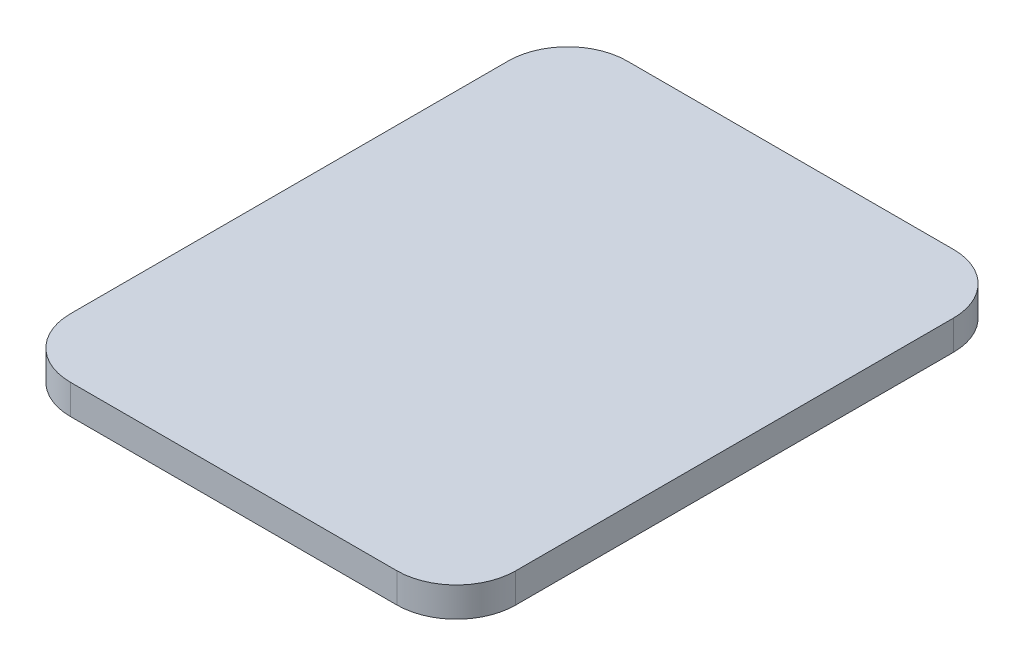
ISO-10303-21;
HEADER;
FILE_DESCRIPTION(('STEP AP214'),'2;1');
FILE_NAME('part.step','',(''),(''),'','','');
FILE_SCHEMA(('AUTOMOTIVE_DESIGN { 1 0 10303 214 1 1 1 1 }'));
ENDSEC;
DATA;
#1=APPLICATION_CONTEXT('core data for automotive mechanical design processes');
#2=APPLICATION_PROTOCOL_DEFINITION('international standard','automotive_design',2000,#1);
#3=PRODUCT_CONTEXT('',#1,'mechanical');
#4=PRODUCT('Part','Part','',(#3));
#5=PRODUCT_RELATED_PRODUCT_CATEGORY('part','',(#4));
#6=PRODUCT_DEFINITION_FORMATION('','',#4);
#7=PRODUCT_DEFINITION_CONTEXT('part definition',#1,'design');
#8=PRODUCT_DEFINITION('design','',#6,#7);
#9=PRODUCT_DEFINITION_SHAPE('','',#8);
#10=(LENGTH_UNIT() NAMED_UNIT(*) SI_UNIT(.MILLI.,.METRE.));
#11=(NAMED_UNIT(*) PLANE_ANGLE_UNIT() SI_UNIT($,.RADIAN.));
#12=(NAMED_UNIT(*) SI_UNIT($,.STERADIAN.) SOLID_ANGLE_UNIT());
#13=UNCERTAINTY_MEASURE_WITH_UNIT(LENGTH_MEASURE(1.E-05),#10,'distance_accuracy_value','');
#14=(GEOMETRIC_REPRESENTATION_CONTEXT(3) GLOBAL_UNCERTAINTY_ASSIGNED_CONTEXT((#13)) GLOBAL_UNIT_ASSIGNED_CONTEXT((#10,
#11,#12)) REPRESENTATION_CONTEXT('',''));
#15=CARTESIAN_POINT('',(0.,0.,0.));
#16=DIRECTION('',(0.,0.,1.));
#17=DIRECTION('',(1.,0.,0.));
#18=AXIS2_PLACEMENT_3D('',#15,#16,#17);
#19=CARTESIAN_POINT('',(-11.,-2.,14.75));
#20=DIRECTION('',(0.,1.,0.));
#21=DIRECTION('',(0.,0.,1.));
#22=AXIS2_PLACEMENT_3D('',#19,#20,#21);
#23=CYLINDRICAL_SURFACE('',#22,4.);
#24=CARTESIAN_POINT('',(-11.,0.,14.75));
#25=DIRECTION('',(0.,1.,0.));
#26=DIRECTION('',(0.,0.,1.));
#27=AXIS2_PLACEMENT_3D('',#24,#25,#26);
#28=CIRCLE('',#27,4.);
#29=CARTESIAN_POINT('',(-15.,0.,14.75));
#30=VERTEX_POINT('',#29);
#31=CARTESIAN_POINT('',(-11.,0.,18.75));
#32=VERTEX_POINT('',#31);
#33=EDGE_CURVE('E142',#30,#32,#28,.T.);
#34=ORIENTED_EDGE('',*,*,#33,.F.);
#35=DIRECTION('',(0.,1.,0.));
#36=VECTOR('',#35,1.);
#37=CARTESIAN_POINT('',(-15.,-2.,14.75));
#38=LINE('',#37,#36);
#39=CARTESIAN_POINT('',(-15.,-2.,14.75));
#40=VERTEX_POINT('',#39);
#41=EDGE_CURVE('E11',#40,#30,#38,.T.);
#42=ORIENTED_EDGE('',*,*,#41,.F.);
#43=CARTESIAN_POINT('',(-11.,-2.,14.75));
#44=DIRECTION('',(0.,1.,0.));
#45=DIRECTION('',(0.,0.,1.));
#46=AXIS2_PLACEMENT_3D('',#43,#44,#45);
#47=CIRCLE('',#46,4.);
#48=CARTESIAN_POINT('',(-11.,-2.,18.75));
#49=VERTEX_POINT('',#48);
#50=EDGE_CURVE('E170',#40,#49,#47,.T.);
#51=ORIENTED_EDGE('',*,*,#50,.T.);
#52=DIRECTION('',(0.,1.,0.));
#53=VECTOR('',#52,1.);
#54=CARTESIAN_POINT('',(-11.,-2.,18.75));
#55=LINE('',#54,#53);
#56=EDGE_CURVE('E42',#49,#32,#55,.T.);
#57=ORIENTED_EDGE('',*,*,#56,.T.);
#58=EDGE_LOOP('',(#34,#42,#51,#57));
#59=FACE_BOUND('',#58,.T.);
#60=ADVANCED_FACE('F39',(#59),#23,.T.);
#61=CARTESIAN_POINT('',(-15.,-2.,-14.75));
#62=DIRECTION('',(-1.,0.,0.));
#63=DIRECTION('',(0.,0.,1.));
#64=AXIS2_PLACEMENT_3D('',#61,#62,#63);
#65=PLANE('',#64);
#66=DIRECTION('',(0.,0.,1.));
#67=VECTOR('',#66,1.);
#68=CARTESIAN_POINT('',(-15.,0.,-14.75));
#69=LINE('',#68,#67);
#70=CARTESIAN_POINT('',(-15.,0.,-14.75));
#71=VERTEX_POINT('',#70);
#72=EDGE_CURVE('E167',#71,#30,#69,.T.);
#73=ORIENTED_EDGE('',*,*,#72,.F.);
#74=DIRECTION('',(0.,1.,0.));
#75=VECTOR('',#74,1.);
#76=CARTESIAN_POINT('',(-15.,-2.,-14.75));
#77=LINE('',#76,#75);
#78=CARTESIAN_POINT('',(-15.,-2.,-14.75));
#79=VERTEX_POINT('',#78);
#80=EDGE_CURVE('E49',#79,#71,#77,.T.);
#81=ORIENTED_EDGE('',*,*,#80,.F.);
#82=DIRECTION('',(0.,0.,1.));
#83=VECTOR('',#82,1.);
#84=CARTESIAN_POINT('',(-15.,-2.,-14.75));
#85=LINE('',#84,#83);
#86=EDGE_CURVE('E128',#79,#40,#85,.T.);
#87=ORIENTED_EDGE('',*,*,#86,.T.);
#88=ORIENTED_EDGE('',*,*,#41,.T.);
#89=EDGE_LOOP('',(#73,#81,#87,#88));
#90=FACE_BOUND('',#89,.T.);
#91=ADVANCED_FACE('F188',(#90),#65,.T.);
#92=CARTESIAN_POINT('',(-11.,-2.,-14.75));
#93=DIRECTION('',(0.,1.,0.));
#94=DIRECTION('',(0.,0.,1.));
#95=AXIS2_PLACEMENT_3D('',#92,#93,#94);
#96=CYLINDRICAL_SURFACE('',#95,4.);
#97=CARTESIAN_POINT('',(-11.,0.,-14.75));
#98=DIRECTION('',(0.,1.,0.));
#99=DIRECTION('',(0.,0.,1.));
#100=AXIS2_PLACEMENT_3D('',#97,#98,#99);
#101=CIRCLE('',#100,4.);
#102=CARTESIAN_POINT('',(-11.,0.,-18.75));
#103=VERTEX_POINT('',#102);
#104=EDGE_CURVE('E114',#103,#71,#101,.T.);
#105=ORIENTED_EDGE('',*,*,#104,.F.);
#106=DIRECTION('',(0.,1.,0.));
#107=VECTOR('',#106,1.);
#108=CARTESIAN_POINT('',(-11.,-2.,-18.75));
#109=LINE('',#108,#107);
#110=CARTESIAN_POINT('',(-11.,-2.,-18.75));
#111=VERTEX_POINT('',#110);
#112=EDGE_CURVE('E109',#111,#103,#109,.T.);
#113=ORIENTED_EDGE('',*,*,#112,.F.);
#114=CARTESIAN_POINT('',(-11.,-2.,-14.75));
#115=DIRECTION('',(0.,1.,0.));
#116=DIRECTION('',(0.,0.,1.));
#117=AXIS2_PLACEMENT_3D('',#114,#115,#116);
#118=CIRCLE('',#117,4.);
#119=EDGE_CURVE('E112',#111,#79,#118,.T.);
#120=ORIENTED_EDGE('',*,*,#119,.T.);
#121=ORIENTED_EDGE('',*,*,#80,.T.);
#122=EDGE_LOOP('',(#105,#113,#120,#121));
#123=FACE_BOUND('',#122,.T.);
#124=ADVANCED_FACE('F111',(#123),#96,.T.);
#125=CARTESIAN_POINT('',(-11.,-2.,-18.75));
#126=DIRECTION('',(0.,0.,-1.));
#127=DIRECTION('',(-1.,0.,0.));
#128=AXIS2_PLACEMENT_3D('',#125,#126,#127);
#129=PLANE('',#128);
#130=DIRECTION('',(-1.,0.,0.));
#131=VECTOR('',#130,1.);
#132=CARTESIAN_POINT('',(-11.,0.,-18.75));
#133=LINE('',#132,#131);
#134=CARTESIAN_POINT('',(11.,0.,-18.75));
#135=VERTEX_POINT('',#134);
#136=EDGE_CURVE('E162',#135,#103,#133,.T.);
#137=ORIENTED_EDGE('',*,*,#136,.F.);
#138=DIRECTION('',(0.,1.,0.));
#139=VECTOR('',#138,1.);
#140=CARTESIAN_POINT('',(11.,-2.,-18.75));
#141=LINE('',#140,#139);
#142=CARTESIAN_POINT('',(11.,-2.,-18.75));
#143=VERTEX_POINT('',#142);
#144=EDGE_CURVE('E120',#143,#135,#141,.T.);
#145=ORIENTED_EDGE('',*,*,#144,.F.);
#146=DIRECTION('',(-1.,0.,0.));
#147=VECTOR('',#146,1.);
#148=CARTESIAN_POINT('',(-11.,-2.,-18.75));
#149=LINE('',#148,#147);
#150=EDGE_CURVE('E126',#143,#111,#149,.T.);
#151=ORIENTED_EDGE('',*,*,#150,.T.);
#152=ORIENTED_EDGE('',*,*,#112,.T.);
#153=EDGE_LOOP('',(#137,#145,#151,#152));
#154=FACE_BOUND('',#153,.T.);
#155=ADVANCED_FACE('F131',(#154),#129,.T.);
#156=CARTESIAN_POINT('',(11.,-2.,-14.75));
#157=DIRECTION('',(0.,1.,0.));
#158=DIRECTION('',(0.,0.,1.));
#159=AXIS2_PLACEMENT_3D('',#156,#157,#158);
#160=CYLINDRICAL_SURFACE('',#159,4.);
#161=CARTESIAN_POINT('',(11.,0.,-14.75));
#162=DIRECTION('',(0.,1.,0.));
#163=DIRECTION('',(0.,0.,-1.));
#164=AXIS2_PLACEMENT_3D('',#161,#162,#163);
#165=CIRCLE('',#164,4.);
#166=CARTESIAN_POINT('',(15.,0.,-14.75));
#167=VERTEX_POINT('',#166);
#168=EDGE_CURVE('E158',#167,#135,#165,.T.);
#169=ORIENTED_EDGE('',*,*,#168,.F.);
#170=DIRECTION('',(0.,1.,0.));
#171=VECTOR('',#170,1.);
#172=CARTESIAN_POINT('',(15.,-2.,-14.75));
#173=LINE('',#172,#171);
#174=CARTESIAN_POINT('',(15.,-2.,-14.75));
#175=VERTEX_POINT('',#174);
#176=EDGE_CURVE('E176',#175,#167,#173,.T.);
#177=ORIENTED_EDGE('',*,*,#176,.F.);
#178=CARTESIAN_POINT('',(11.,-2.,-14.75));
#179=DIRECTION('',(0.,1.,0.));
#180=DIRECTION('',(0.,0.,-1.));
#181=AXIS2_PLACEMENT_3D('',#178,#179,#180);
#182=CIRCLE('',#181,4.);
#183=EDGE_CURVE('E133',#175,#143,#182,.T.);
#184=ORIENTED_EDGE('',*,*,#183,.T.);
#185=ORIENTED_EDGE('',*,*,#144,.T.);
#186=EDGE_LOOP('',(#169,#177,#184,#185));
#187=FACE_BOUND('',#186,.T.);
#188=ADVANCED_FACE('F201',(#187),#160,.T.);
#189=CARTESIAN_POINT('',(15.,-2.,-14.75));
#190=DIRECTION('',(1.,0.,0.));
#191=DIRECTION('',(0.,0.,-1.));
#192=AXIS2_PLACEMENT_3D('',#189,#190,#191);
#193=PLANE('',#192);
#194=DIRECTION('',(0.,0.,-1.));
#195=VECTOR('',#194,1.);
#196=CARTESIAN_POINT('',(15.,0.,-14.75));
#197=LINE('',#196,#195);
#198=CARTESIAN_POINT('',(15.,0.,14.75));
#199=VERTEX_POINT('',#198);
#200=EDGE_CURVE('E154',#199,#167,#197,.T.);
#201=ORIENTED_EDGE('',*,*,#200,.F.);
#202=DIRECTION('',(0.,1.,0.));
#203=VECTOR('',#202,1.);
#204=CARTESIAN_POINT('',(15.,-2.,14.75));
#205=LINE('',#204,#203);
#206=CARTESIAN_POINT('',(15.,-2.,14.75));
#207=VERTEX_POINT('',#206);
#208=EDGE_CURVE('E179',#207,#199,#205,.T.);
#209=ORIENTED_EDGE('',*,*,#208,.F.);
#210=DIRECTION('',(0.,0.,-1.));
#211=VECTOR('',#210,1.);
#212=CARTESIAN_POINT('',(15.,-2.,-14.75));
#213=LINE('',#212,#211);
#214=EDGE_CURVE('E136',#207,#175,#213,.T.);
#215=ORIENTED_EDGE('',*,*,#214,.T.);
#216=ORIENTED_EDGE('',*,*,#176,.T.);
#217=EDGE_LOOP('',(#201,#209,#215,#216));
#218=FACE_BOUND('',#217,.T.);
#219=ADVANCED_FACE('F204',(#218),#193,.T.);
#220=CARTESIAN_POINT('',(11.,-2.,14.75));
#221=DIRECTION('',(0.,1.,0.));
#222=DIRECTION('',(0.,0.,1.));
#223=AXIS2_PLACEMENT_3D('',#220,#221,#222);
#224=CYLINDRICAL_SURFACE('',#223,4.);
#225=CARTESIAN_POINT('',(11.,0.,14.75));
#226=DIRECTION('',(0.,1.,0.));
#227=DIRECTION('',(0.,0.,1.));
#228=AXIS2_PLACEMENT_3D('',#225,#226,#227);
#229=CIRCLE('',#228,4.);
#230=CARTESIAN_POINT('',(11.,0.,18.75));
#231=VERTEX_POINT('',#230);
#232=EDGE_CURVE('E150',#231,#199,#229,.T.);
#233=ORIENTED_EDGE('',*,*,#232,.F.);
#234=DIRECTION('',(0.,1.,0.));
#235=VECTOR('',#234,1.);
#236=CARTESIAN_POINT('',(11.,-2.,18.75));
#237=LINE('',#236,#235);
#238=CARTESIAN_POINT('',(11.,-2.,18.75));
#239=VERTEX_POINT('',#238);
#240=EDGE_CURVE('E181',#239,#231,#237,.T.);
#241=ORIENTED_EDGE('',*,*,#240,.F.);
#242=CARTESIAN_POINT('',(11.,-2.,14.75));
#243=DIRECTION('',(0.,1.,0.));
#244=DIRECTION('',(0.,0.,1.));
#245=AXIS2_PLACEMENT_3D('',#242,#243,#244);
#246=CIRCLE('',#245,4.);
#247=EDGE_CURVE('E279',#239,#207,#246,.T.);
#248=ORIENTED_EDGE('',*,*,#247,.T.);
#249=ORIENTED_EDGE('',*,*,#208,.T.);
#250=EDGE_LOOP('',(#233,#241,#248,#249));
#251=FACE_BOUND('',#250,.T.);
#252=ADVANCED_FACE('F208',(#251),#224,.T.);
#253=CARTESIAN_POINT('',(-11.,-2.,18.75));
#254=DIRECTION('',(0.,0.,1.));
#255=DIRECTION('',(1.,0.,0.));
#256=AXIS2_PLACEMENT_3D('',#253,#254,#255);
#257=PLANE('',#256);
#258=DIRECTION('',(1.,0.,0.));
#259=VECTOR('',#258,1.);
#260=CARTESIAN_POINT('',(-11.,0.,18.75));
#261=LINE('',#260,#259);
#262=EDGE_CURVE('E146',#32,#231,#261,.T.);
#263=ORIENTED_EDGE('',*,*,#262,.F.);
#264=ORIENTED_EDGE('',*,*,#56,.F.);
#265=DIRECTION('',(1.,0.,0.));
#266=VECTOR('',#265,1.);
#267=CARTESIAN_POINT('',(-11.,-2.,18.75));
#268=LINE('',#267,#266);
#269=EDGE_CURVE('E282',#49,#239,#268,.T.);
#270=ORIENTED_EDGE('',*,*,#269,.T.);
#271=ORIENTED_EDGE('',*,*,#240,.T.);
#272=EDGE_LOOP('',(#263,#264,#270,#271));
#273=FACE_BOUND('',#272,.T.);
#274=ADVANCED_FACE('F185',(#273),#257,.T.);
#275=CARTESIAN_POINT('',(-11.,-2.,14.75));
#276=DIRECTION('',(0.,1.,0.));
#277=DIRECTION('',(0.,0.,1.));
#278=AXIS2_PLACEMENT_3D('',#275,#276,#277);
#279=PLANE('',#278);
#280=ORIENTED_EDGE('',*,*,#50,.F.);
#281=ORIENTED_EDGE('',*,*,#86,.F.);
#282=ORIENTED_EDGE('',*,*,#119,.F.);
#283=ORIENTED_EDGE('',*,*,#150,.F.);
#284=ORIENTED_EDGE('',*,*,#183,.F.);
#285=ORIENTED_EDGE('',*,*,#214,.F.);
#286=ORIENTED_EDGE('',*,*,#247,.F.);
#287=ORIENTED_EDGE('',*,*,#269,.F.);
#288=EDGE_LOOP('',(#280,#281,#282,#283,#284,#285,#286,#287));
#289=FACE_BOUND('',#288,.T.);
#290=ADVANCED_FACE('F124',(#289),#279,.F.);
#291=CARTESIAN_POINT('',(-11.,0.,14.75));
#292=DIRECTION('',(0.,1.,0.));
#293=DIRECTION('',(0.,0.,1.));
#294=AXIS2_PLACEMENT_3D('',#291,#292,#293);
#295=PLANE('',#294);
#296=ORIENTED_EDGE('',*,*,#33,.T.);
#297=ORIENTED_EDGE('',*,*,#262,.T.);
#298=ORIENTED_EDGE('',*,*,#232,.T.);
#299=ORIENTED_EDGE('',*,*,#200,.T.);
#300=ORIENTED_EDGE('',*,*,#168,.T.);
#301=ORIENTED_EDGE('',*,*,#136,.T.);
#302=ORIENTED_EDGE('',*,*,#104,.T.);
#303=ORIENTED_EDGE('',*,*,#72,.T.);
#304=EDGE_LOOP('',(#296,#297,#298,#299,#300,#301,#302,#303));
#305=FACE_BOUND('',#304,.T.);
#306=ADVANCED_FACE('F187',(#305),#295,.T.);
#307=CLOSED_SHELL('',(#60,#91,#124,#155,#188,#219,#252,#274,#290,#306));
#308=MANIFOLD_SOLID_BREP('B2',#307);
#309=ADVANCED_BREP_SHAPE_REPRESENTATION('',(#18,#308),#14);
#310=SHAPE_DEFINITION_REPRESENTATION(#9,#309);
ENDSEC;
END-ISO-10303-21;
